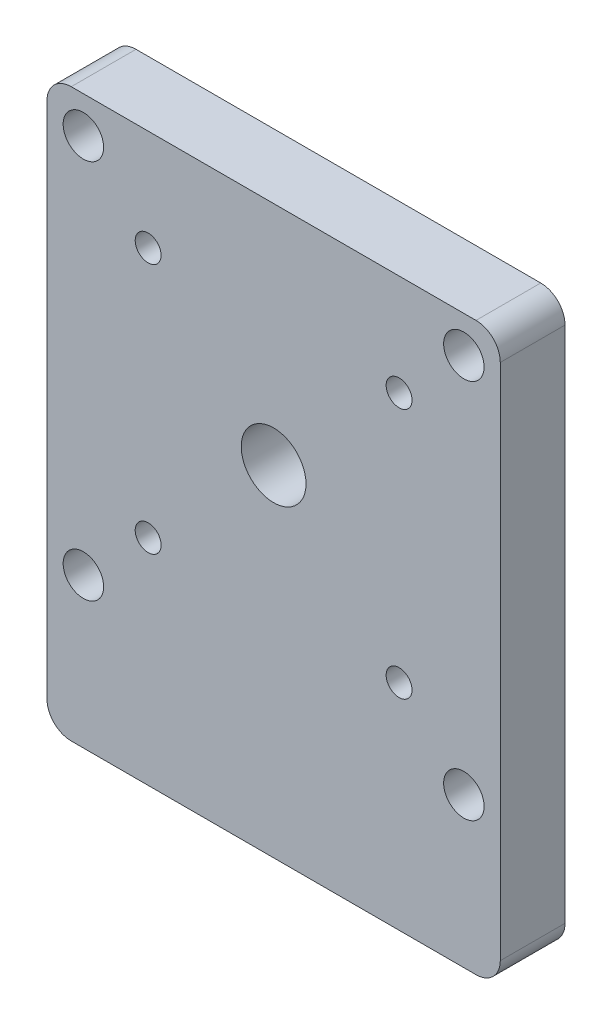
ISO-10303-21;
HEADER;
FILE_DESCRIPTION(('STEP AP214'),'2;1');
FILE_NAME('part.step','',(''),(''),'','','');
FILE_SCHEMA(('AUTOMOTIVE_DESIGN { 1 0 10303 214 1 1 1 1 }'));
ENDSEC;
DATA;
#1=APPLICATION_CONTEXT('core data for automotive mechanical design processes');
#2=APPLICATION_PROTOCOL_DEFINITION('international standard','automotive_design',2000,#1);
#3=PRODUCT_CONTEXT('',#1,'mechanical');
#4=PRODUCT('Part','Part','',(#3));
#5=PRODUCT_RELATED_PRODUCT_CATEGORY('part','',(#4));
#6=PRODUCT_DEFINITION_FORMATION('','',#4);
#7=PRODUCT_DEFINITION_CONTEXT('part definition',#1,'design');
#8=PRODUCT_DEFINITION('design','',#6,#7);
#9=PRODUCT_DEFINITION_SHAPE('','',#8);
#10=(LENGTH_UNIT() NAMED_UNIT(*) SI_UNIT(.MILLI.,.METRE.));
#11=(NAMED_UNIT(*) PLANE_ANGLE_UNIT() SI_UNIT($,.RADIAN.));
#12=(NAMED_UNIT(*) SI_UNIT($,.STERADIAN.) SOLID_ANGLE_UNIT());
#13=UNCERTAINTY_MEASURE_WITH_UNIT(LENGTH_MEASURE(1.E-05),#10,'distance_accuracy_value','');
#14=(GEOMETRIC_REPRESENTATION_CONTEXT(3) GLOBAL_UNCERTAINTY_ASSIGNED_CONTEXT((#13)) GLOBAL_UNIT_ASSIGNED_CONTEXT((#10,
#11,#12)) REPRESENTATION_CONTEXT('',''));
#15=CARTESIAN_POINT('',(0.,0.,0.));
#16=DIRECTION('',(0.,0.,1.));
#17=DIRECTION('',(1.,0.,0.));
#18=AXIS2_PLACEMENT_3D('',#15,#16,#17);
#19=CARTESIAN_POINT('',(28.,-35.,4.));
#20=DIRECTION('',(-1.,0.,0.));
#21=DIRECTION('',(0.,0.,1.));
#22=AXIS2_PLACEMENT_3D('',#19,#20,#21);
#23=PLANE('',#22);
#24=DIRECTION('',(0.,1.,0.));
#25=VECTOR('',#24,1.);
#26=CARTESIAN_POINT('',(28.,-35.,4.));
#27=LINE('',#26,#25);
#28=CARTESIAN_POINT('',(28.,-32.,4.));
#29=VERTEX_POINT('',#28);
#30=CARTESIAN_POINT('',(28.,32.,4.));
#31=VERTEX_POINT('',#30);
#32=EDGE_CURVE('E124',#29,#31,#27,.T.);
#33=ORIENTED_EDGE('',*,*,#32,.F.);
#34=DIRECTION('',(0.,0.,-1.));
#35=VECTOR('',#34,1.);
#36=CARTESIAN_POINT('',(28.,-32.,4.));
#37=LINE('',#36,#35);
#38=CARTESIAN_POINT('',(28.,-32.,-4.));
#39=VERTEX_POINT('',#38);
#40=EDGE_CURVE('E109',#29,#39,#37,.T.);
#41=ORIENTED_EDGE('',*,*,#40,.T.);
#42=DIRECTION('',(0.,1.,0.));
#43=VECTOR('',#42,1.);
#44=CARTESIAN_POINT('',(28.,-35.,-4.));
#45=LINE('',#44,#43);
#46=CARTESIAN_POINT('',(28.,32.,-4.));
#47=VERTEX_POINT('',#46);
#48=EDGE_CURVE('E121',#39,#47,#45,.T.);
#49=ORIENTED_EDGE('',*,*,#48,.T.);
#50=DIRECTION('',(0.,0.,-1.));
#51=VECTOR('',#50,1.);
#52=CARTESIAN_POINT('',(28.,32.,4.));
#53=LINE('',#52,#51);
#54=EDGE_CURVE('E126',#47,#31,#53,.F.);
#55=ORIENTED_EDGE('',*,*,#54,.T.);
#56=EDGE_LOOP('',(#33,#41,#49,#55));
#57=FACE_BOUND('',#56,.T.);
#58=ADVANCED_FACE('F39',(#57),#23,.F.);
#59=CARTESIAN_POINT('',(-28.,35.,4.));
#60=DIRECTION('',(0.,-1.,0.));
#61=DIRECTION('',(0.,0.,-1.));
#62=AXIS2_PLACEMENT_3D('',#59,#60,#61);
#63=PLANE('',#62);
#64=DIRECTION('',(-1.,0.,0.));
#65=VECTOR('',#64,1.);
#66=CARTESIAN_POINT('',(-28.,35.,-4.));
#67=LINE('',#66,#65);
#68=CARTESIAN_POINT('',(25.,35.,-4.));
#69=VERTEX_POINT('',#68);
#70=CARTESIAN_POINT('',(-25.,35.,-4.));
#71=VERTEX_POINT('',#70);
#72=EDGE_CURVE('E130',#69,#71,#67,.T.);
#73=ORIENTED_EDGE('',*,*,#72,.T.);
#74=DIRECTION('',(0.,0.,-1.));
#75=VECTOR('',#74,1.);
#76=CARTESIAN_POINT('',(-25.,35.,4.));
#77=LINE('',#76,#75);
#78=CARTESIAN_POINT('',(-25.,35.,4.));
#79=VERTEX_POINT('',#78);
#80=EDGE_CURVE('E11',#71,#79,#77,.F.);
#81=ORIENTED_EDGE('',*,*,#80,.T.);
#82=DIRECTION('',(-1.,0.,0.));
#83=VECTOR('',#82,1.);
#84=CARTESIAN_POINT('',(-28.,35.,4.));
#85=LINE('',#84,#83);
#86=CARTESIAN_POINT('',(25.,35.,4.));
#87=VERTEX_POINT('',#86);
#88=EDGE_CURVE('E170',#87,#79,#85,.T.);
#89=ORIENTED_EDGE('',*,*,#88,.F.);
#90=DIRECTION('',(0.,0.,-1.));
#91=VECTOR('',#90,1.);
#92=CARTESIAN_POINT('',(25.,35.,4.));
#93=LINE('',#92,#91);
#94=EDGE_CURVE('E47',#87,#69,#93,.T.);
#95=ORIENTED_EDGE('',*,*,#94,.T.);
#96=EDGE_LOOP('',(#73,#81,#89,#95));
#97=FACE_BOUND('',#96,.T.);
#98=ADVANCED_FACE('F168',(#97),#63,.F.);
#99=CARTESIAN_POINT('',(-28.,-35.,4.));
#100=DIRECTION('',(1.,0.,0.));
#101=DIRECTION('',(0.,0.,-1.));
#102=AXIS2_PLACEMENT_3D('',#99,#100,#101);
#103=PLANE('',#102);
#104=DIRECTION('',(0.,-1.,0.));
#105=VECTOR('',#104,1.);
#106=CARTESIAN_POINT('',(-28.,-35.,-4.));
#107=LINE('',#106,#105);
#108=CARTESIAN_POINT('',(-28.,32.,-4.));
#109=VERTEX_POINT('',#108);
#110=CARTESIAN_POINT('',(-28.,-32.,-4.));
#111=VERTEX_POINT('',#110);
#112=EDGE_CURVE('E134',#109,#111,#107,.T.);
#113=ORIENTED_EDGE('',*,*,#112,.T.);
#114=DIRECTION('',(0.,0.,-1.));
#115=VECTOR('',#114,1.);
#116=CARTESIAN_POINT('',(-28.,-32.,4.));
#117=LINE('',#116,#115);
#118=CARTESIAN_POINT('',(-28.,-32.,4.));
#119=VERTEX_POINT('',#118);
#120=EDGE_CURVE('E54',#111,#119,#117,.F.);
#121=ORIENTED_EDGE('',*,*,#120,.T.);
#122=DIRECTION('',(0.,-1.,0.));
#123=VECTOR('',#122,1.);
#124=CARTESIAN_POINT('',(-28.,-35.,4.));
#125=LINE('',#124,#123);
#126=CARTESIAN_POINT('',(-28.,32.,4.));
#127=VERTEX_POINT('',#126);
#128=EDGE_CURVE('E178',#127,#119,#125,.T.);
#129=ORIENTED_EDGE('',*,*,#128,.F.);
#130=DIRECTION('',(0.,0.,-1.));
#131=VECTOR('',#130,1.);
#132=CARTESIAN_POINT('',(-28.,32.,4.));
#133=LINE('',#132,#131);
#134=EDGE_CURVE('E161',#127,#109,#133,.T.);
#135=ORIENTED_EDGE('',*,*,#134,.T.);
#136=EDGE_LOOP('',(#113,#121,#129,#135));
#137=FACE_BOUND('',#136,.T.);
#138=ADVANCED_FACE('F177',(#137),#103,.F.);
#139=CARTESIAN_POINT('',(-28.,-35.,4.));
#140=DIRECTION('',(0.,1.,0.));
#141=DIRECTION('',(0.,0.,1.));
#142=AXIS2_PLACEMENT_3D('',#139,#140,#141);
#143=PLANE('',#142);
#144=DIRECTION('',(1.,0.,0.));
#145=VECTOR('',#144,1.);
#146=CARTESIAN_POINT('',(-28.,-35.,-4.));
#147=LINE('',#146,#145);
#148=CARTESIAN_POINT('',(-25.,-35.,-4.));
#149=VERTEX_POINT('',#148);
#150=CARTESIAN_POINT('',(25.,-35.,-4.));
#151=VERTEX_POINT('',#150);
#152=EDGE_CURVE('E144',#149,#151,#147,.T.);
#153=ORIENTED_EDGE('',*,*,#152,.T.);
#154=DIRECTION('',(0.,0.,-1.));
#155=VECTOR('',#154,1.);
#156=CARTESIAN_POINT('',(25.,-35.,4.));
#157=LINE('',#156,#155);
#158=CARTESIAN_POINT('',(25.,-35.,4.));
#159=VERTEX_POINT('',#158);
#160=EDGE_CURVE('E110',#151,#159,#157,.F.);
#161=ORIENTED_EDGE('',*,*,#160,.T.);
#162=DIRECTION('',(1.,0.,0.));
#163=VECTOR('',#162,1.);
#164=CARTESIAN_POINT('',(-28.,-35.,4.));
#165=LINE('',#164,#163);
#166=CARTESIAN_POINT('',(-25.,-35.,4.));
#167=VERTEX_POINT('',#166);
#168=EDGE_CURVE('E140',#167,#159,#165,.T.);
#169=ORIENTED_EDGE('',*,*,#168,.F.);
#170=DIRECTION('',(0.,0.,-1.));
#171=VECTOR('',#170,1.);
#172=CARTESIAN_POINT('',(-25.,-35.,4.));
#173=LINE('',#172,#171);
#174=EDGE_CURVE('E115',#167,#149,#173,.T.);
#175=ORIENTED_EDGE('',*,*,#174,.T.);
#176=EDGE_LOOP('',(#153,#161,#169,#175));
#177=FACE_BOUND('',#176,.T.);
#178=ADVANCED_FACE('F248',(#177),#143,.F.);
#179=CARTESIAN_POINT('',(0.,0.,4.));
#180=DIRECTION('',(0.,0.,-1.));
#181=DIRECTION('',(-1.,0.,0.));
#182=AXIS2_PLACEMENT_3D('',#179,#180,#181);
#183=PLANE('',#182);
#184=CARTESIAN_POINT('',(23.5,30.5,4.));
#185=DIRECTION('',(0.,0.,1.));
#186=DIRECTION('',(1.,0.,0.));
#187=AXIS2_PLACEMENT_3D('',#184,#185,#186);
#188=CIRCLE('',#187,2.5);
#189=CARTESIAN_POINT('',(26.,30.5,4.));
#190=VERTEX_POINT('',#189);
#191=EDGE_CURVE('E206',#190,#190,#188,.T.);
#192=ORIENTED_EDGE('',*,*,#191,.F.);
#193=EDGE_LOOP('',(#192));
#194=FACE_BOUND('',#193,.T.);
#195=CARTESIAN_POINT('',(23.5,-16.5,4.));
#196=DIRECTION('',(0.,0.,1.));
#197=DIRECTION('',(1.,0.,0.));
#198=AXIS2_PLACEMENT_3D('',#195,#196,#197);
#199=CIRCLE('',#198,2.5);
#200=CARTESIAN_POINT('',(26.,-16.5,4.));
#201=VERTEX_POINT('',#200);
#202=EDGE_CURVE('E200',#201,#201,#199,.T.);
#203=ORIENTED_EDGE('',*,*,#202,.F.);
#204=EDGE_LOOP('',(#203));
#205=FACE_BOUND('',#204,.T.);
#206=CARTESIAN_POINT('',(-23.5,-16.5,4.));
#207=DIRECTION('',(0.,0.,1.));
#208=DIRECTION('',(1.,0.,0.));
#209=AXIS2_PLACEMENT_3D('',#206,#207,#208);
#210=CIRCLE('',#209,2.5);
#211=CARTESIAN_POINT('',(-21.,-16.5,4.));
#212=VERTEX_POINT('',#211);
#213=EDGE_CURVE('E194',#212,#212,#210,.T.);
#214=ORIENTED_EDGE('',*,*,#213,.F.);
#215=EDGE_LOOP('',(#214));
#216=FACE_BOUND('',#215,.T.);
#217=CARTESIAN_POINT('',(0.,7.,4.));
#218=DIRECTION('',(0.,0.,1.));
#219=DIRECTION('',(1.,0.,0.));
#220=AXIS2_PLACEMENT_3D('',#217,#218,#219);
#221=CIRCLE('',#220,4.);
#222=CARTESIAN_POINT('',(4.,7.,4.));
#223=VERTEX_POINT('',#222);
#224=EDGE_CURVE('E187',#223,#223,#221,.T.);
#225=ORIENTED_EDGE('',*,*,#224,.F.);
#226=EDGE_LOOP('',(#225));
#227=FACE_BOUND('',#226,.T.);
#228=CARTESIAN_POINT('',(-15.5,22.5,4.));
#229=DIRECTION('',(0.,0.,1.));
#230=DIRECTION('',(1.,0.,0.));
#231=AXIS2_PLACEMENT_3D('',#228,#229,#230);
#232=CIRCLE('',#231,1.6);
#233=CARTESIAN_POINT('',(-13.9,22.5,4.));
#234=VERTEX_POINT('',#233);
#235=EDGE_CURVE('E229',#234,#234,#232,.T.);
#236=ORIENTED_EDGE('',*,*,#235,.F.);
#237=EDGE_LOOP('',(#236));
#238=FACE_BOUND('',#237,.T.);
#239=CARTESIAN_POINT('',(15.5,22.5,4.));
#240=DIRECTION('',(0.,0.,1.));
#241=DIRECTION('',(1.,0.,0.));
#242=AXIS2_PLACEMENT_3D('',#239,#240,#241);
#243=CIRCLE('',#242,1.6);
#244=CARTESIAN_POINT('',(17.1,22.5,4.));
#245=VERTEX_POINT('',#244);
#246=EDGE_CURVE('E223',#245,#245,#243,.T.);
#247=ORIENTED_EDGE('',*,*,#246,.F.);
#248=EDGE_LOOP('',(#247));
#249=FACE_BOUND('',#248,.T.);
#250=CARTESIAN_POINT('',(15.5,-8.5,4.));
#251=DIRECTION('',(0.,0.,1.));
#252=DIRECTION('',(1.,0.,0.));
#253=AXIS2_PLACEMENT_3D('',#250,#251,#252);
#254=CIRCLE('',#253,1.6);
#255=CARTESIAN_POINT('',(17.1,-8.5,4.));
#256=VERTEX_POINT('',#255);
#257=EDGE_CURVE('E217',#256,#256,#254,.T.);
#258=ORIENTED_EDGE('',*,*,#257,.F.);
#259=EDGE_LOOP('',(#258));
#260=FACE_BOUND('',#259,.T.);
#261=CARTESIAN_POINT('',(-15.5,-8.5,4.));
#262=DIRECTION('',(0.,0.,1.));
#263=DIRECTION('',(1.,0.,0.));
#264=AXIS2_PLACEMENT_3D('',#261,#262,#263);
#265=CIRCLE('',#264,1.6);
#266=CARTESIAN_POINT('',(-13.9,-8.5,4.));
#267=VERTEX_POINT('',#266);
#268=EDGE_CURVE('E211',#267,#267,#265,.T.);
#269=ORIENTED_EDGE('',*,*,#268,.F.);
#270=EDGE_LOOP('',(#269));
#271=FACE_BOUND('',#270,.T.);
#272=CARTESIAN_POINT('',(-23.5,30.5,4.));
#273=DIRECTION('',(0.,0.,1.));
#274=DIRECTION('',(1.,0.,0.));
#275=AXIS2_PLACEMENT_3D('',#272,#273,#274);
#276=CIRCLE('',#275,2.5);
#277=CARTESIAN_POINT('',(-21.,30.5,4.));
#278=VERTEX_POINT('',#277);
#279=EDGE_CURVE('E137',#278,#278,#276,.T.);
#280=ORIENTED_EDGE('',*,*,#279,.F.);
#281=EDGE_LOOP('',(#280));
#282=FACE_BOUND('',#281,.T.);
#283=ORIENTED_EDGE('',*,*,#168,.T.);
#284=CARTESIAN_POINT('',(25.,-32.,4.));
#285=DIRECTION('',(0.,0.,-1.));
#286=DIRECTION('',(-1.,0.,0.));
#287=AXIS2_PLACEMENT_3D('',#284,#285,#286);
#288=CIRCLE('',#287,3.);
#289=EDGE_CURVE('E159',#159,#29,#288,.F.);
#290=ORIENTED_EDGE('',*,*,#289,.T.);
#291=ORIENTED_EDGE('',*,*,#32,.T.);
#292=CARTESIAN_POINT('',(25.,32.,4.));
#293=DIRECTION('',(0.,0.,-1.));
#294=DIRECTION('',(-1.,0.,0.));
#295=AXIS2_PLACEMENT_3D('',#292,#293,#294);
#296=CIRCLE('',#295,3.);
#297=EDGE_CURVE('E154',#31,#87,#296,.F.);
#298=ORIENTED_EDGE('',*,*,#297,.T.);
#299=ORIENTED_EDGE('',*,*,#88,.T.);
#300=CARTESIAN_POINT('',(-25.,32.,4.));
#301=DIRECTION('',(0.,0.,-1.));
#302=DIRECTION('',(-1.,0.,0.));
#303=AXIS2_PLACEMENT_3D('',#300,#301,#302);
#304=CIRCLE('',#303,3.);
#305=EDGE_CURVE('E61',#79,#127,#304,.F.);
#306=ORIENTED_EDGE('',*,*,#305,.T.);
#307=ORIENTED_EDGE('',*,*,#128,.T.);
#308=CARTESIAN_POINT('',(-25.,-32.,4.));
#309=DIRECTION('',(0.,0.,-1.));
#310=DIRECTION('',(-1.,0.,0.));
#311=AXIS2_PLACEMENT_3D('',#308,#309,#310);
#312=CIRCLE('',#311,3.);
#313=EDGE_CURVE('E157',#119,#167,#312,.F.);
#314=ORIENTED_EDGE('',*,*,#313,.T.);
#315=EDGE_LOOP('',(#283,#290,#291,#298,#299,#306,#307,#314));
#316=FACE_BOUND('',#315,.T.);
#317=ADVANCED_FACE('F245',(#194,#205,#216,#227,#238,#249,#260,#271,#282,#316),#183,.F.);
#318=CARTESIAN_POINT('',(0.,0.,-4.));
#319=DIRECTION('',(0.,0.,-1.));
#320=DIRECTION('',(-1.,0.,0.));
#321=AXIS2_PLACEMENT_3D('',#318,#319,#320);
#322=PLANE('',#321);
#323=CARTESIAN_POINT('',(23.5,30.5,-4.));
#324=DIRECTION('',(0.,0.,1.));
#325=DIRECTION('',(1.,0.,0.));
#326=AXIS2_PLACEMENT_3D('',#323,#324,#325);
#327=CIRCLE('',#326,2.5);
#328=CARTESIAN_POINT('',(26.,30.5,-4.));
#329=VERTEX_POINT('',#328);
#330=EDGE_CURVE('E185',#329,#329,#327,.T.);
#331=ORIENTED_EDGE('',*,*,#330,.T.);
#332=EDGE_LOOP('',(#331));
#333=FACE_BOUND('',#332,.T.);
#334=CARTESIAN_POINT('',(23.5,-16.5,-4.));
#335=DIRECTION('',(0.,0.,1.));
#336=DIRECTION('',(1.,0.,0.));
#337=AXIS2_PLACEMENT_3D('',#334,#335,#336);
#338=CIRCLE('',#337,2.5);
#339=CARTESIAN_POINT('',(26.,-16.5,-4.));
#340=VERTEX_POINT('',#339);
#341=EDGE_CURVE('E203',#340,#340,#338,.T.);
#342=ORIENTED_EDGE('',*,*,#341,.T.);
#343=EDGE_LOOP('',(#342));
#344=FACE_BOUND('',#343,.T.);
#345=CARTESIAN_POINT('',(-23.5,-16.5,-4.));
#346=DIRECTION('',(0.,0.,1.));
#347=DIRECTION('',(1.,0.,0.));
#348=AXIS2_PLACEMENT_3D('',#345,#346,#347);
#349=CIRCLE('',#348,2.5);
#350=CARTESIAN_POINT('',(-21.,-16.5,-4.));
#351=VERTEX_POINT('',#350);
#352=EDGE_CURVE('E197',#351,#351,#349,.T.);
#353=ORIENTED_EDGE('',*,*,#352,.T.);
#354=EDGE_LOOP('',(#353));
#355=FACE_BOUND('',#354,.T.);
#356=CARTESIAN_POINT('',(0.,7.,-4.));
#357=DIRECTION('',(0.,0.,1.));
#358=DIRECTION('',(1.,0.,0.));
#359=AXIS2_PLACEMENT_3D('',#356,#357,#358);
#360=CIRCLE('',#359,4.);
#361=CARTESIAN_POINT('',(4.,7.,-4.));
#362=VERTEX_POINT('',#361);
#363=EDGE_CURVE('E190',#362,#362,#360,.T.);
#364=ORIENTED_EDGE('',*,*,#363,.T.);
#365=EDGE_LOOP('',(#364));
#366=FACE_BOUND('',#365,.T.);
#367=CARTESIAN_POINT('',(-15.5,22.5,-4.));
#368=DIRECTION('',(0.,0.,1.));
#369=DIRECTION('',(1.,0.,0.));
#370=AXIS2_PLACEMENT_3D('',#367,#368,#369);
#371=CIRCLE('',#370,1.6);
#372=CARTESIAN_POINT('',(-13.9,22.5,-4.));
#373=VERTEX_POINT('',#372);
#374=EDGE_CURVE('E191',#373,#373,#371,.T.);
#375=ORIENTED_EDGE('',*,*,#374,.T.);
#376=EDGE_LOOP('',(#375));
#377=FACE_BOUND('',#376,.T.);
#378=CARTESIAN_POINT('',(15.5,22.5,-4.));
#379=DIRECTION('',(0.,0.,1.));
#380=DIRECTION('',(1.,0.,0.));
#381=AXIS2_PLACEMENT_3D('',#378,#379,#380);
#382=CIRCLE('',#381,1.6);
#383=CARTESIAN_POINT('',(17.1,22.5,-4.));
#384=VERTEX_POINT('',#383);
#385=EDGE_CURVE('E226',#384,#384,#382,.T.);
#386=ORIENTED_EDGE('',*,*,#385,.T.);
#387=EDGE_LOOP('',(#386));
#388=FACE_BOUND('',#387,.T.);
#389=CARTESIAN_POINT('',(15.5,-8.5,-4.));
#390=DIRECTION('',(0.,0.,1.));
#391=DIRECTION('',(1.,0.,0.));
#392=AXIS2_PLACEMENT_3D('',#389,#390,#391);
#393=CIRCLE('',#392,1.6);
#394=CARTESIAN_POINT('',(17.1,-8.5,-4.));
#395=VERTEX_POINT('',#394);
#396=EDGE_CURVE('E220',#395,#395,#393,.T.);
#397=ORIENTED_EDGE('',*,*,#396,.T.);
#398=EDGE_LOOP('',(#397));
#399=FACE_BOUND('',#398,.T.);
#400=CARTESIAN_POINT('',(-15.5,-8.5,-4.));
#401=DIRECTION('',(0.,0.,1.));
#402=DIRECTION('',(1.,0.,0.));
#403=AXIS2_PLACEMENT_3D('',#400,#401,#402);
#404=CIRCLE('',#403,1.6);
#405=CARTESIAN_POINT('',(-13.9,-8.5,-4.));
#406=VERTEX_POINT('',#405);
#407=EDGE_CURVE('E214',#406,#406,#404,.T.);
#408=ORIENTED_EDGE('',*,*,#407,.T.);
#409=EDGE_LOOP('',(#408));
#410=FACE_BOUND('',#409,.T.);
#411=CARTESIAN_POINT('',(-23.5,30.5,-4.));
#412=DIRECTION('',(0.,0.,1.));
#413=DIRECTION('',(1.,0.,0.));
#414=AXIS2_PLACEMENT_3D('',#411,#412,#413);
#415=CIRCLE('',#414,2.5);
#416=CARTESIAN_POINT('',(-21.,30.5,-4.));
#417=VERTEX_POINT('',#416);
#418=EDGE_CURVE('E131',#417,#417,#415,.T.);
#419=ORIENTED_EDGE('',*,*,#418,.T.);
#420=EDGE_LOOP('',(#419));
#421=FACE_BOUND('',#420,.T.);
#422=ORIENTED_EDGE('',*,*,#48,.F.);
#423=CARTESIAN_POINT('',(25.,-32.,-4.));
#424=DIRECTION('',(0.,0.,-1.));
#425=DIRECTION('',(-1.,0.,0.));
#426=AXIS2_PLACEMENT_3D('',#423,#424,#425);
#427=CIRCLE('',#426,3.);
#428=EDGE_CURVE('E105',#39,#151,#427,.T.);
#429=ORIENTED_EDGE('',*,*,#428,.T.);
#430=ORIENTED_EDGE('',*,*,#152,.F.);
#431=CARTESIAN_POINT('',(-25.,-32.,-4.));
#432=DIRECTION('',(0.,0.,-1.));
#433=DIRECTION('',(-1.,0.,0.));
#434=AXIS2_PLACEMENT_3D('',#431,#432,#433);
#435=CIRCLE('',#434,3.);
#436=EDGE_CURVE('E116',#149,#111,#435,.T.);
#437=ORIENTED_EDGE('',*,*,#436,.T.);
#438=ORIENTED_EDGE('',*,*,#112,.F.);
#439=CARTESIAN_POINT('',(-25.,32.,-4.));
#440=DIRECTION('',(0.,0.,-1.));
#441=DIRECTION('',(-1.,0.,0.));
#442=AXIS2_PLACEMENT_3D('',#439,#440,#441);
#443=CIRCLE('',#442,3.);
#444=EDGE_CURVE('E148',#109,#71,#443,.T.);
#445=ORIENTED_EDGE('',*,*,#444,.T.);
#446=ORIENTED_EDGE('',*,*,#72,.F.);
#447=CARTESIAN_POINT('',(25.,32.,-4.));
#448=DIRECTION('',(0.,0.,-1.));
#449=DIRECTION('',(-1.,0.,0.));
#450=AXIS2_PLACEMENT_3D('',#447,#448,#449);
#451=CIRCLE('',#450,3.);
#452=EDGE_CURVE('E125',#69,#47,#451,.T.);
#453=ORIENTED_EDGE('',*,*,#452,.T.);
#454=EDGE_LOOP('',(#422,#429,#430,#437,#438,#445,#446,#453));
#455=FACE_BOUND('',#454,.T.);
#456=ADVANCED_FACE('F128',(#333,#344,#355,#366,#377,#388,#399,#410,#421,#455),#322,.T.);
#457=CARTESIAN_POINT('',(-23.5,30.5,-4.));
#458=DIRECTION('',(0.,0.,1.));
#459=DIRECTION('',(1.,0.,0.));
#460=AXIS2_PLACEMENT_3D('',#457,#458,#459);
#461=CYLINDRICAL_SURFACE('',#460,2.5);
#462=ORIENTED_EDGE('',*,*,#418,.F.);
#463=EDGE_LOOP('',(#462));
#464=FACE_BOUND('',#463,.T.);
#465=ORIENTED_EDGE('',*,*,#279,.T.);
#466=EDGE_LOOP('',(#465));
#467=FACE_BOUND('',#466,.T.);
#468=ADVANCED_FACE('F284',(#464,#467),#461,.F.);
#469=CARTESIAN_POINT('',(-15.5,-8.5,-4.));
#470=DIRECTION('',(0.,0.,1.));
#471=DIRECTION('',(1.,0.,0.));
#472=AXIS2_PLACEMENT_3D('',#469,#470,#471);
#473=CYLINDRICAL_SURFACE('',#472,1.6);
#474=ORIENTED_EDGE('',*,*,#407,.F.);
#475=EDGE_LOOP('',(#474));
#476=FACE_BOUND('',#475,.T.);
#477=ORIENTED_EDGE('',*,*,#268,.T.);
#478=EDGE_LOOP('',(#477));
#479=FACE_BOUND('',#478,.T.);
#480=ADVANCED_FACE('F289',(#476,#479),#473,.F.);
#481=CARTESIAN_POINT('',(15.5,-8.5,-4.));
#482=DIRECTION('',(0.,0.,1.));
#483=DIRECTION('',(1.,0.,0.));
#484=AXIS2_PLACEMENT_3D('',#481,#482,#483);
#485=CYLINDRICAL_SURFACE('',#484,1.6);
#486=ORIENTED_EDGE('',*,*,#396,.F.);
#487=EDGE_LOOP('',(#486));
#488=FACE_BOUND('',#487,.T.);
#489=ORIENTED_EDGE('',*,*,#257,.T.);
#490=EDGE_LOOP('',(#489));
#491=FACE_BOUND('',#490,.T.);
#492=ADVANCED_FACE('F306',(#488,#491),#485,.F.);
#493=CARTESIAN_POINT('',(15.5,22.5,-4.));
#494=DIRECTION('',(0.,0.,1.));
#495=DIRECTION('',(1.,0.,0.));
#496=AXIS2_PLACEMENT_3D('',#493,#494,#495);
#497=CYLINDRICAL_SURFACE('',#496,1.6);
#498=ORIENTED_EDGE('',*,*,#385,.F.);
#499=EDGE_LOOP('',(#498));
#500=FACE_BOUND('',#499,.T.);
#501=ORIENTED_EDGE('',*,*,#246,.T.);
#502=EDGE_LOOP('',(#501));
#503=FACE_BOUND('',#502,.T.);
#504=ADVANCED_FACE('F241',(#500,#503),#497,.F.);
#505=CARTESIAN_POINT('',(-15.5,22.5,-4.));
#506=DIRECTION('',(0.,0.,1.));
#507=DIRECTION('',(1.,0.,0.));
#508=AXIS2_PLACEMENT_3D('',#505,#506,#507);
#509=CYLINDRICAL_SURFACE('',#508,1.6);
#510=ORIENTED_EDGE('',*,*,#374,.F.);
#511=EDGE_LOOP('',(#510));
#512=FACE_BOUND('',#511,.T.);
#513=ORIENTED_EDGE('',*,*,#235,.T.);
#514=EDGE_LOOP('',(#513));
#515=FACE_BOUND('',#514,.T.);
#516=ADVANCED_FACE('F237',(#512,#515),#509,.F.);
#517=CARTESIAN_POINT('',(0.,7.,-4.));
#518=DIRECTION('',(0.,0.,1.));
#519=DIRECTION('',(1.,0.,0.));
#520=AXIS2_PLACEMENT_3D('',#517,#518,#519);
#521=CYLINDRICAL_SURFACE('',#520,4.);
#522=ORIENTED_EDGE('',*,*,#363,.F.);
#523=EDGE_LOOP('',(#522));
#524=FACE_BOUND('',#523,.T.);
#525=ORIENTED_EDGE('',*,*,#224,.T.);
#526=EDGE_LOOP('',(#525));
#527=FACE_BOUND('',#526,.T.);
#528=ADVANCED_FACE('F240',(#524,#527),#521,.F.);
#529=CARTESIAN_POINT('',(-23.5,-16.5,-4.));
#530=DIRECTION('',(0.,0.,1.));
#531=DIRECTION('',(1.,0.,0.));
#532=AXIS2_PLACEMENT_3D('',#529,#530,#531);
#533=CYLINDRICAL_SURFACE('',#532,2.5);
#534=ORIENTED_EDGE('',*,*,#352,.F.);
#535=EDGE_LOOP('',(#534));
#536=FACE_BOUND('',#535,.T.);
#537=ORIENTED_EDGE('',*,*,#213,.T.);
#538=EDGE_LOOP('',(#537));
#539=FACE_BOUND('',#538,.T.);
#540=ADVANCED_FACE('F293',(#536,#539),#533,.F.);
#541=CARTESIAN_POINT('',(23.5,-16.5,-4.));
#542=DIRECTION('',(0.,0.,1.));
#543=DIRECTION('',(1.,0.,0.));
#544=AXIS2_PLACEMENT_3D('',#541,#542,#543);
#545=CYLINDRICAL_SURFACE('',#544,2.5);
#546=ORIENTED_EDGE('',*,*,#341,.F.);
#547=EDGE_LOOP('',(#546));
#548=FACE_BOUND('',#547,.T.);
#549=ORIENTED_EDGE('',*,*,#202,.T.);
#550=EDGE_LOOP('',(#549));
#551=FACE_BOUND('',#550,.T.);
#552=ADVANCED_FACE('F297',(#548,#551),#545,.F.);
#553=CARTESIAN_POINT('',(23.5,30.5,-4.));
#554=DIRECTION('',(0.,0.,1.));
#555=DIRECTION('',(1.,0.,0.));
#556=AXIS2_PLACEMENT_3D('',#553,#554,#555);
#557=CYLINDRICAL_SURFACE('',#556,2.5);
#558=ORIENTED_EDGE('',*,*,#330,.F.);
#559=EDGE_LOOP('',(#558));
#560=FACE_BOUND('',#559,.T.);
#561=ORIENTED_EDGE('',*,*,#191,.T.);
#562=EDGE_LOOP('',(#561));
#563=FACE_BOUND('',#562,.T.);
#564=ADVANCED_FACE('F269',(#560,#563),#557,.F.);
#565=CARTESIAN_POINT('',(25.,-32.,4.));
#566=DIRECTION('',(0.,0.,-1.));
#567=DIRECTION('',(-1.,0.,0.));
#568=AXIS2_PLACEMENT_3D('',#565,#566,#567);
#569=CYLINDRICAL_SURFACE('',#568,3.);
#570=ORIENTED_EDGE('',*,*,#289,.F.);
#571=ORIENTED_EDGE('',*,*,#160,.F.);
#572=ORIENTED_EDGE('',*,*,#428,.F.);
#573=ORIENTED_EDGE('',*,*,#40,.F.);
#574=EDGE_LOOP('',(#570,#571,#572,#573));
#575=FACE_BOUND('',#574,.T.);
#576=ADVANCED_FACE('F108',(#575),#569,.T.);
#577=CARTESIAN_POINT('',(-25.,-32.,4.));
#578=DIRECTION('',(0.,0.,-1.));
#579=DIRECTION('',(-1.,0.,0.));
#580=AXIS2_PLACEMENT_3D('',#577,#578,#579);
#581=CYLINDRICAL_SURFACE('',#580,3.);
#582=ORIENTED_EDGE('',*,*,#313,.F.);
#583=ORIENTED_EDGE('',*,*,#120,.F.);
#584=ORIENTED_EDGE('',*,*,#436,.F.);
#585=ORIENTED_EDGE('',*,*,#174,.F.);
#586=EDGE_LOOP('',(#582,#583,#584,#585));
#587=FACE_BOUND('',#586,.T.);
#588=ADVANCED_FACE('F262',(#587),#581,.T.);
#589=CARTESIAN_POINT('',(-25.,32.,4.));
#590=DIRECTION('',(0.,0.,-1.));
#591=DIRECTION('',(-1.,0.,0.));
#592=AXIS2_PLACEMENT_3D('',#589,#590,#591);
#593=CYLINDRICAL_SURFACE('',#592,3.);
#594=ORIENTED_EDGE('',*,*,#305,.F.);
#595=ORIENTED_EDGE('',*,*,#80,.F.);
#596=ORIENTED_EDGE('',*,*,#444,.F.);
#597=ORIENTED_EDGE('',*,*,#134,.F.);
#598=EDGE_LOOP('',(#594,#595,#596,#597));
#599=FACE_BOUND('',#598,.T.);
#600=ADVANCED_FACE('F176',(#599),#593,.T.);
#601=CARTESIAN_POINT('',(25.,32.,4.));
#602=DIRECTION('',(0.,0.,-1.));
#603=DIRECTION('',(-1.,0.,0.));
#604=AXIS2_PLACEMENT_3D('',#601,#602,#603);
#605=CYLINDRICAL_SURFACE('',#604,3.);
#606=ORIENTED_EDGE('',*,*,#297,.F.);
#607=ORIENTED_EDGE('',*,*,#54,.F.);
#608=ORIENTED_EDGE('',*,*,#452,.F.);
#609=ORIENTED_EDGE('',*,*,#94,.F.);
#610=EDGE_LOOP('',(#606,#607,#608,#609));
#611=FACE_BOUND('',#610,.T.);
#612=ADVANCED_FACE('F41',(#611),#605,.T.);
#613=CLOSED_SHELL('',(#58,#98,#138,#178,#317,#456,#468,#480,#492,#504,#516,#528,#540,#552,#564,
#576,#588,#600,#612));
#614=MANIFOLD_SOLID_BREP('B2',#613);
#615=ADVANCED_BREP_SHAPE_REPRESENTATION('',(#18,#614),#14);
#616=SHAPE_DEFINITION_REPRESENTATION(#9,#615);
ENDSEC;
END-ISO-10303-21;
